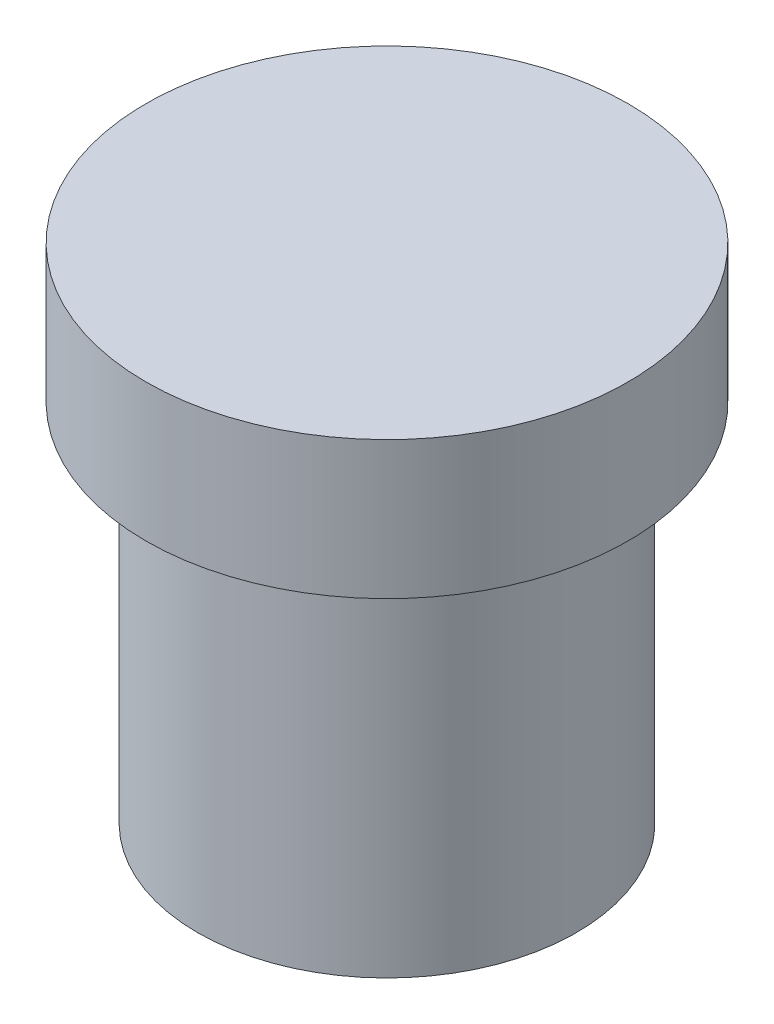
ISO-10303-21;
HEADER;
FILE_DESCRIPTION(('STEP AP214'),'2;1');
FILE_NAME('part.step','',(''),(''),'','','');
FILE_SCHEMA(('AUTOMOTIVE_DESIGN { 1 0 10303 214 1 1 1 1 }'));
ENDSEC;
DATA;
#1=APPLICATION_CONTEXT('core data for automotive mechanical design processes');
#2=APPLICATION_PROTOCOL_DEFINITION('international standard','automotive_design',2000,#1);
#3=PRODUCT_CONTEXT('',#1,'mechanical');
#4=PRODUCT('Part','Part','',(#3));
#5=PRODUCT_RELATED_PRODUCT_CATEGORY('part','',(#4));
#6=PRODUCT_DEFINITION_FORMATION('','',#4);
#7=PRODUCT_DEFINITION_CONTEXT('part definition',#1,'design');
#8=PRODUCT_DEFINITION('design','',#6,#7);
#9=PRODUCT_DEFINITION_SHAPE('','',#8);
#10=(LENGTH_UNIT() NAMED_UNIT(*) SI_UNIT(.MILLI.,.METRE.));
#11=(NAMED_UNIT(*) PLANE_ANGLE_UNIT() SI_UNIT($,.RADIAN.));
#12=(NAMED_UNIT(*) SI_UNIT($,.STERADIAN.) SOLID_ANGLE_UNIT());
#13=UNCERTAINTY_MEASURE_WITH_UNIT(LENGTH_MEASURE(1.E-05),#10,'distance_accuracy_value','');
#14=(GEOMETRIC_REPRESENTATION_CONTEXT(3) GLOBAL_UNCERTAINTY_ASSIGNED_CONTEXT((#13)) GLOBAL_UNIT_ASSIGNED_CONTEXT((#10,
#11,#12)) REPRESENTATION_CONTEXT('',''));
#15=CARTESIAN_POINT('',(0.,0.,0.));
#16=DIRECTION('',(0.,0.,1.));
#17=DIRECTION('',(1.,0.,0.));
#18=AXIS2_PLACEMENT_3D('',#15,#16,#17);
#19=CARTESIAN_POINT('',(0.,2.5,0.));
#20=DIRECTION('',(0.,-1.,0.));
#21=DIRECTION('',(0.,0.,-1.));
#22=AXIS2_PLACEMENT_3D('',#19,#20,#21);
#23=CYLINDRICAL_SURFACE('',#22,1.25);
#24=CARTESIAN_POINT('',(0.,2.5,0.));
#25=DIRECTION('',(0.,1.,0.));
#26=DIRECTION('',(0.,0.,1.));
#27=AXIS2_PLACEMENT_3D('',#24,#25,#26);
#28=CIRCLE('',#27,1.25);
#29=CARTESIAN_POINT('',(0.,2.5,1.25));
#30=VERTEX_POINT('',#29);
#31=EDGE_CURVE('E10',#30,#30,#28,.T.);
#32=ORIENTED_EDGE('',*,*,#31,.F.);
#33=EDGE_LOOP('',(#32));
#34=FACE_BOUND('',#33,.T.);
#35=CARTESIAN_POINT('',(0.,0.,0.));
#36=DIRECTION('',(0.,1.,0.));
#37=DIRECTION('',(0.,0.,1.));
#38=AXIS2_PLACEMENT_3D('',#35,#36,#37);
#39=CIRCLE('',#38,1.25);
#40=CARTESIAN_POINT('',(0.,0.,1.25));
#41=VERTEX_POINT('',#40);
#42=EDGE_CURVE('E36',#41,#41,#39,.T.);
#43=ORIENTED_EDGE('',*,*,#42,.T.);
#44=EDGE_LOOP('',(#43));
#45=FACE_BOUND('',#44,.T.);
#46=ADVANCED_FACE('F33',(#34,#45),#23,.T.);
#47=CARTESIAN_POINT('',(0.,0.,0.));
#48=DIRECTION('',(0.,1.,0.));
#49=DIRECTION('',(0.,0.,1.));
#50=AXIS2_PLACEMENT_3D('',#47,#48,#49);
#51=PLANE('',#50);
#52=ORIENTED_EDGE('',*,*,#42,.F.);
#53=EDGE_LOOP('',(#52));
#54=FACE_BOUND('',#53,.T.);
#55=ADVANCED_FACE('F75',(#54),#51,.F.);
#56=CARTESIAN_POINT('',(0.,15.75,0.));
#57=DIRECTION('',(0.,-1.,0.));
#58=DIRECTION('',(0.,0.,-1.));
#59=AXIS2_PLACEMENT_3D('',#56,#57,#58);
#60=CYLINDRICAL_SURFACE('',#59,6.875);
#61=CARTESIAN_POINT('',(0.,15.75,0.));
#62=DIRECTION('',(0.,1.,0.));
#63=DIRECTION('',(0.,0.,1.));
#64=AXIS2_PLACEMENT_3D('',#61,#62,#63);
#65=CIRCLE('',#64,6.875);
#66=CARTESIAN_POINT('',(0.,15.75,6.875));
#67=VERTEX_POINT('',#66);
#68=EDGE_CURVE('E43',#67,#67,#65,.T.);
#69=ORIENTED_EDGE('',*,*,#68,.F.);
#70=EDGE_LOOP('',(#69));
#71=FACE_BOUND('',#70,.T.);
#72=CARTESIAN_POINT('',(0.,2.5,0.));
#73=DIRECTION('',(0.,1.,0.));
#74=DIRECTION('',(0.,0.,1.));
#75=AXIS2_PLACEMENT_3D('',#72,#73,#74);
#76=CIRCLE('',#75,6.875);
#77=CARTESIAN_POINT('',(0.,2.5,6.875));
#78=VERTEX_POINT('',#77);
#79=EDGE_CURVE('E45',#78,#78,#76,.T.);
#80=ORIENTED_EDGE('',*,*,#79,.T.);
#81=EDGE_LOOP('',(#80));
#82=FACE_BOUND('',#81,.T.);
#83=ADVANCED_FACE('F80',(#71,#82),#60,.T.);
#84=CARTESIAN_POINT('',(0.,2.5,0.));
#85=DIRECTION('',(0.,1.,0.));
#86=DIRECTION('',(0.,0.,1.));
#87=AXIS2_PLACEMENT_3D('',#84,#85,#86);
#88=PLANE('',#87);
#89=ORIENTED_EDGE('',*,*,#31,.T.);
#90=EDGE_LOOP('',(#89));
#91=FACE_BOUND('',#90,.T.);
#92=ORIENTED_EDGE('',*,*,#79,.F.);
#93=EDGE_LOOP('',(#92));
#94=FACE_BOUND('',#93,.T.);
#95=ADVANCED_FACE('F62',(#91,#94),#88,.F.);
#96=CARTESIAN_POINT('',(0.,20.75,0.));
#97=DIRECTION('',(0.,-1.,0.));
#98=DIRECTION('',(0.,0.,-1.));
#99=AXIS2_PLACEMENT_3D('',#96,#97,#98);
#100=CYLINDRICAL_SURFACE('',#99,8.75);
#101=CARTESIAN_POINT('',(0.,20.75,0.));
#102=DIRECTION('',(0.,1.,0.));
#103=DIRECTION('',(0.,0.,1.));
#104=AXIS2_PLACEMENT_3D('',#101,#102,#103);
#105=CIRCLE('',#104,8.75);
#106=CARTESIAN_POINT('',(0.,20.75,8.75));
#107=VERTEX_POINT('',#106);
#108=EDGE_CURVE('E48',#107,#107,#105,.T.);
#109=ORIENTED_EDGE('',*,*,#108,.F.);
#110=EDGE_LOOP('',(#109));
#111=FACE_BOUND('',#110,.T.);
#112=CARTESIAN_POINT('',(0.,15.75,0.));
#113=DIRECTION('',(0.,1.,0.));
#114=DIRECTION('',(0.,0.,1.));
#115=AXIS2_PLACEMENT_3D('',#112,#113,#114);
#116=CIRCLE('',#115,8.75);
#117=CARTESIAN_POINT('',(0.,15.75,8.75));
#118=VERTEX_POINT('',#117);
#119=EDGE_CURVE('E51',#118,#118,#116,.T.);
#120=ORIENTED_EDGE('',*,*,#119,.T.);
#121=EDGE_LOOP('',(#120));
#122=FACE_BOUND('',#121,.T.);
#123=ADVANCED_FACE('F59',(#111,#122),#100,.T.);
#124=CARTESIAN_POINT('',(0.,20.75,0.));
#125=DIRECTION('',(0.,1.,0.));
#126=DIRECTION('',(0.,0.,1.));
#127=AXIS2_PLACEMENT_3D('',#124,#125,#126);
#128=PLANE('',#127);
#129=ORIENTED_EDGE('',*,*,#108,.T.);
#130=EDGE_LOOP('',(#129));
#131=FACE_BOUND('',#130,.T.);
#132=ADVANCED_FACE('F57',(#131),#128,.T.);
#133=CARTESIAN_POINT('',(0.,15.75,0.));
#134=DIRECTION('',(0.,1.,0.));
#135=DIRECTION('',(0.,0.,1.));
#136=AXIS2_PLACEMENT_3D('',#133,#134,#135);
#137=PLANE('',#136);
#138=ORIENTED_EDGE('',*,*,#68,.T.);
#139=EDGE_LOOP('',(#138));
#140=FACE_BOUND('',#139,.T.);
#141=ORIENTED_EDGE('',*,*,#119,.F.);
#142=EDGE_LOOP('',(#141));
#143=FACE_BOUND('',#142,.T.);
#144=ADVANCED_FACE('F66',(#140,#143),#137,.F.);
#145=CLOSED_SHELL('',(#46,#55,#83,#95,#123,#132,#144));
#146=MANIFOLD_SOLID_BREP('B2',#145);
#147=ADVANCED_BREP_SHAPE_REPRESENTATION('',(#18,#146),#14);
#148=SHAPE_DEFINITION_REPRESENTATION(#9,#147);
ENDSEC;
END-ISO-10303-21;
